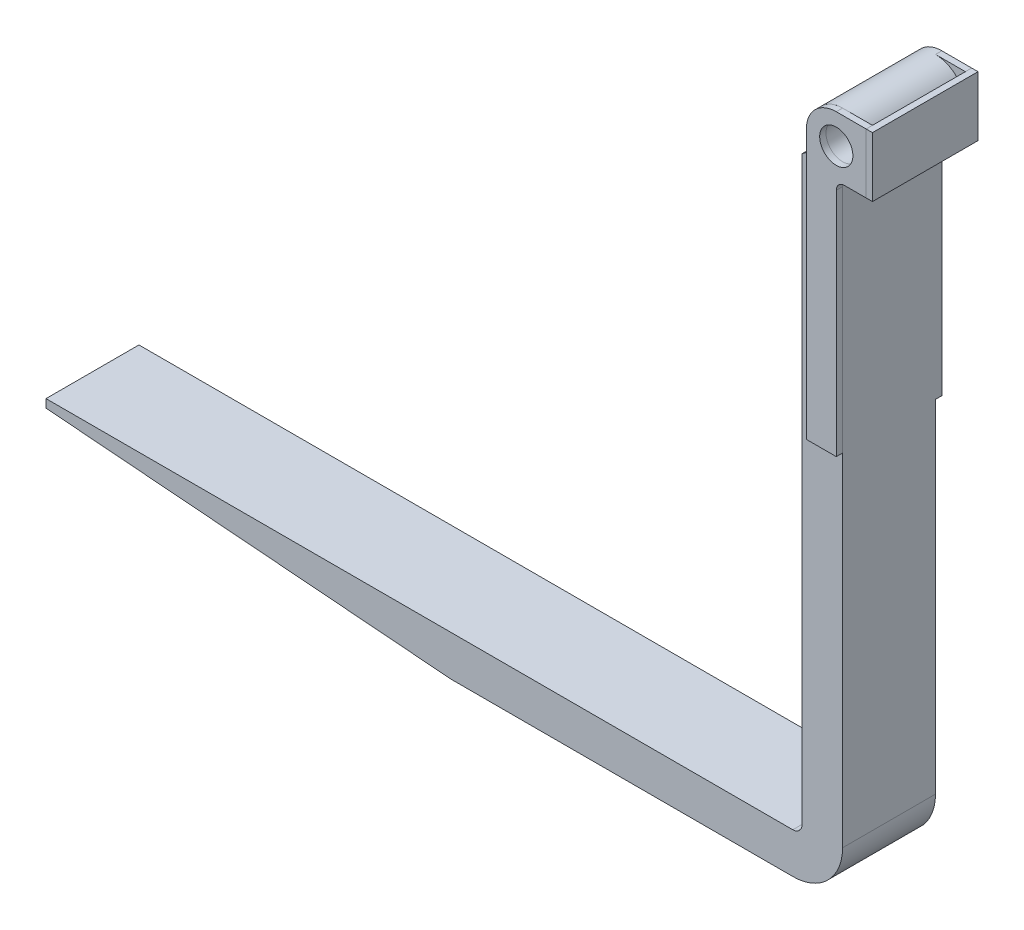
ISO-10303-21;
HEADER;
FILE_DESCRIPTION(('STEP AP214'),'2;1');
FILE_NAME('part.step','',(''),(''),'','','');
FILE_SCHEMA(('AUTOMOTIVE_DESIGN { 1 0 10303 214 1 1 1 1 }'));
ENDSEC;
DATA;
#1=APPLICATION_CONTEXT('core data for automotive mechanical design processes');
#2=APPLICATION_PROTOCOL_DEFINITION('international standard','automotive_design',2000,#1);
#3=PRODUCT_CONTEXT('',#1,'mechanical');
#4=PRODUCT('Part','Part','',(#3));
#5=PRODUCT_RELATED_PRODUCT_CATEGORY('part','',(#4));
#6=PRODUCT_DEFINITION_FORMATION('','',#4);
#7=PRODUCT_DEFINITION_CONTEXT('part definition',#1,'design');
#8=PRODUCT_DEFINITION('design','',#6,#7);
#9=PRODUCT_DEFINITION_SHAPE('','',#8);
#10=(LENGTH_UNIT() NAMED_UNIT(*) SI_UNIT(.MILLI.,.METRE.));
#11=(NAMED_UNIT(*) PLANE_ANGLE_UNIT() SI_UNIT($,.RADIAN.));
#12=(NAMED_UNIT(*) SI_UNIT($,.STERADIAN.) SOLID_ANGLE_UNIT());
#13=UNCERTAINTY_MEASURE_WITH_UNIT(LENGTH_MEASURE(1.E-05),#10,'distance_accuracy_value','');
#14=(GEOMETRIC_REPRESENTATION_CONTEXT(3) GLOBAL_UNCERTAINTY_ASSIGNED_CONTEXT((#13)) GLOBAL_UNIT_ASSIGNED_CONTEXT((#10,
#11,#12)) REPRESENTATION_CONTEXT('',''));
#15=CARTESIAN_POINT('',(0.,0.,0.));
#16=DIRECTION('',(0.,0.,1.));
#17=DIRECTION('',(1.,0.,0.));
#18=AXIS2_PLACEMENT_3D('',#15,#16,#17);
#19=CARTESIAN_POINT('',(54.5,1040.,79.5));
#20=DIRECTION('',(0.,0.,-1.));
#21=DIRECTION('',(-1.,0.,0.));
#22=AXIS2_PLACEMENT_3D('',#19,#20,#21);
#23=PLANE('',#22);
#24=DIRECTION('',(0.,-1.,0.));
#25=VECTOR('',#24,1.);
#26=CARTESIAN_POINT('',(45.,1040.,79.5));
#27=LINE('',#26,#25);
#28=CARTESIAN_POINT('',(45.,1040.,79.5));
#29=VERTEX_POINT('',#28);
#30=CARTESIAN_POINT('',(45.,950.,79.5));
#31=VERTEX_POINT('',#30);
#32=EDGE_CURVE('E110',#29,#31,#27,.T.);
#33=ORIENTED_EDGE('',*,*,#32,.T.);
#34=DIRECTION('',(-1.,0.,0.));
#35=VECTOR('',#34,1.);
#36=CARTESIAN_POINT('',(54.5,950.,79.5));
#37=LINE('',#36,#35);
#38=CARTESIAN_POINT('',(54.5,950.,79.5));
#39=VERTEX_POINT('',#38);
#40=EDGE_CURVE('E12',#39,#31,#37,.T.);
#41=ORIENTED_EDGE('',*,*,#40,.F.);
#42=DIRECTION('',(0.,-1.,0.));
#43=VECTOR('',#42,1.);
#44=CARTESIAN_POINT('',(54.5,1040.,79.5));
#45=LINE('',#44,#43);
#46=CARTESIAN_POINT('',(54.5,1040.,79.5));
#47=VERTEX_POINT('',#46);
#48=EDGE_CURVE('E98',#47,#39,#45,.T.);
#49=ORIENTED_EDGE('',*,*,#48,.F.);
#50=DIRECTION('',(-1.,0.,0.));
#51=VECTOR('',#50,1.);
#52=CARTESIAN_POINT('',(54.5,1040.,79.5));
#53=LINE('',#52,#51);
#54=EDGE_CURVE('E106',#47,#29,#53,.T.);
#55=ORIENTED_EDGE('',*,*,#54,.T.);
#56=EDGE_LOOP('',(#33,#41,#49,#55));
#57=FACE_BOUND('',#56,.T.);
#58=ADVANCED_FACE('F47',(#57),#23,.F.);
#59=CARTESIAN_POINT('',(54.5,950.,79.5));
#60=DIRECTION('',(0.,1.,0.));
#61=DIRECTION('',(0.,0.,1.));
#62=AXIS2_PLACEMENT_3D('',#59,#60,#61);
#63=PLANE('',#62);
#64=DIRECTION('',(0.,0.,-1.));
#65=VECTOR('',#64,1.);
#66=CARTESIAN_POINT('',(45.,950.,79.5));
#67=LINE('',#66,#65);
#68=CARTESIAN_POINT('',(45.,950.,-79.5));
#69=VERTEX_POINT('',#68);
#70=EDGE_CURVE('E102',#31,#69,#67,.T.);
#71=ORIENTED_EDGE('',*,*,#70,.T.);
#72=DIRECTION('',(-1.,0.,0.));
#73=VECTOR('',#72,1.);
#74=CARTESIAN_POINT('',(54.5,950.,-79.5));
#75=LINE('',#74,#73);
#76=CARTESIAN_POINT('',(54.5,950.,-79.5));
#77=VERTEX_POINT('',#76);
#78=EDGE_CURVE('E55',#77,#69,#75,.T.);
#79=ORIENTED_EDGE('',*,*,#78,.F.);
#80=DIRECTION('',(0.,0.,-1.));
#81=VECTOR('',#80,1.);
#82=CARTESIAN_POINT('',(54.5,950.,79.5));
#83=LINE('',#82,#81);
#84=EDGE_CURVE('E93',#39,#77,#83,.T.);
#85=ORIENTED_EDGE('',*,*,#84,.F.);
#86=ORIENTED_EDGE('',*,*,#40,.T.);
#87=EDGE_LOOP('',(#71,#79,#85,#86));
#88=FACE_BOUND('',#87,.T.);
#89=ADVANCED_FACE('F101',(#88),#63,.F.);
#90=CARTESIAN_POINT('',(54.5,1040.,-79.5));
#91=DIRECTION('',(0.,0.,1.));
#92=DIRECTION('',(1.,0.,0.));
#93=AXIS2_PLACEMENT_3D('',#90,#91,#92);
#94=PLANE('',#93);
#95=DIRECTION('',(0.,1.,0.));
#96=VECTOR('',#95,1.);
#97=CARTESIAN_POINT('',(45.,1040.,-79.5));
#98=LINE('',#97,#96);
#99=CARTESIAN_POINT('',(45.,1040.,-79.5));
#100=VERTEX_POINT('',#99);
#101=EDGE_CURVE('E80',#69,#100,#98,.T.);
#102=ORIENTED_EDGE('',*,*,#101,.T.);
#103=DIRECTION('',(-1.,0.,0.));
#104=VECTOR('',#103,1.);
#105=CARTESIAN_POINT('',(54.5,1040.,-79.5));
#106=LINE('',#105,#104);
#107=CARTESIAN_POINT('',(54.5,1040.,-79.5));
#108=VERTEX_POINT('',#107);
#109=EDGE_CURVE('E103',#108,#100,#106,.T.);
#110=ORIENTED_EDGE('',*,*,#109,.F.);
#111=DIRECTION('',(0.,1.,0.));
#112=VECTOR('',#111,1.);
#113=CARTESIAN_POINT('',(54.5,1040.,-79.5));
#114=LINE('',#113,#112);
#115=EDGE_CURVE('E96',#77,#108,#114,.T.);
#116=ORIENTED_EDGE('',*,*,#115,.F.);
#117=ORIENTED_EDGE('',*,*,#78,.T.);
#118=EDGE_LOOP('',(#102,#110,#116,#117));
#119=FACE_BOUND('',#118,.T.);
#120=ADVANCED_FACE('F104',(#119),#94,.F.);
#121=CARTESIAN_POINT('',(54.5,1040.,79.5));
#122=DIRECTION('',(0.,-1.,0.));
#123=DIRECTION('',(0.,0.,-1.));
#124=AXIS2_PLACEMENT_3D('',#121,#122,#123);
#125=PLANE('',#124);
#126=DIRECTION('',(0.,0.,1.));
#127=VECTOR('',#126,1.);
#128=CARTESIAN_POINT('',(45.,1040.,79.5));
#129=LINE('',#128,#127);
#130=EDGE_CURVE('E86',#100,#29,#129,.T.);
#131=ORIENTED_EDGE('',*,*,#130,.T.);
#132=ORIENTED_EDGE('',*,*,#54,.F.);
#133=DIRECTION('',(0.,0.,1.));
#134=VECTOR('',#133,1.);
#135=CARTESIAN_POINT('',(54.5,1040.,79.5));
#136=LINE('',#135,#134);
#137=EDGE_CURVE('E63',#108,#47,#136,.T.);
#138=ORIENTED_EDGE('',*,*,#137,.F.);
#139=ORIENTED_EDGE('',*,*,#109,.T.);
#140=EDGE_LOOP('',(#131,#132,#138,#139));
#141=FACE_BOUND('',#140,.T.);
#142=ADVANCED_FACE('F117',(#141),#125,.F.);
#143=CARTESIAN_POINT('',(54.5,950.,79.5));
#144=DIRECTION('',(1.,0.,0.));
#145=DIRECTION('',(0.,0.,-1.));
#146=AXIS2_PLACEMENT_3D('',#143,#144,#145);
#147=PLANE('',#146);
#148=ORIENTED_EDGE('',*,*,#48,.T.);
#149=ORIENTED_EDGE('',*,*,#84,.T.);
#150=ORIENTED_EDGE('',*,*,#115,.T.);
#151=ORIENTED_EDGE('',*,*,#137,.T.);
#152=EDGE_LOOP('',(#148,#149,#150,#151));
#153=FACE_BOUND('',#152,.T.);
#154=ADVANCED_FACE('F94',(#153),#147,.T.);
#155=CARTESIAN_POINT('',(45.,950.,79.5));
#156=DIRECTION('',(1.,0.,0.));
#157=DIRECTION('',(0.,0.,-1.));
#158=AXIS2_PLACEMENT_3D('',#155,#156,#157);
#159=PLANE('',#158);
#160=ORIENTED_EDGE('',*,*,#32,.F.);
#161=ORIENTED_EDGE('',*,*,#130,.F.);
#162=ORIENTED_EDGE('',*,*,#101,.F.);
#163=ORIENTED_EDGE('',*,*,#70,.F.);
#164=EDGE_LOOP('',(#160,#161,#162,#163));
#165=FACE_BOUND('',#164,.T.);
#166=ADVANCED_FACE('F120',(#165),#159,.F.);
#167=CLOSED_SHELL('',(#58,#89,#120,#142,#154,#166));
#168=MANIFOLD_SOLID_BREP('B2',#167);
#169=CARTESIAN_POINT('',(-1.11012405566185E-13,457.909002372828,79.5));
#170=DIRECTION('',(-1.,0.,0.));
#171=DIRECTION('',(0.,-1.,0.));
#172=AXIS2_PLACEMENT_3D('',#169,#170,#171);
#173=PLANE('',#172);
#174=DIRECTION('',(0.,1.,0.));
#175=VECTOR('',#174,1.);
#176=CARTESIAN_POINT('',(-1.11012405566185E-13,457.909002372828,70.));
#177=LINE('',#176,#175);
#178=CARTESIAN_POINT('',(-1.10472724874183E-13,590.,70.));
#179=VERTEX_POINT('',#178);
#180=CARTESIAN_POINT('',(-1.09052960023826E-13,937.5,70.));
#181=VERTEX_POINT('',#180);
#182=EDGE_CURVE('E279',#179,#181,#177,.T.);
#183=ORIENTED_EDGE('',*,*,#182,.T.);
#184=DIRECTION('',(0.,0.,-1.));
#185=VECTOR('',#184,1.);
#186=CARTESIAN_POINT('',(-1.09052960023826E-13,937.5,79.5));
#187=LINE('',#186,#185);
#188=CARTESIAN_POINT('',(-1.09052960023826E-13,937.5,79.5));
#189=VERTEX_POINT('',#188);
#190=EDGE_CURVE('E45',#189,#181,#187,.T.);
#191=ORIENTED_EDGE('',*,*,#190,.F.);
#192=DIRECTION('',(0.,1.,0.));
#193=VECTOR('',#192,1.);
#194=CARTESIAN_POINT('',(-1.11012405566185E-13,457.909002372828,79.5));
#195=LINE('',#194,#193);
#196=CARTESIAN_POINT('',(-1.10472724874183E-13,590.,79.5));
#197=VERTEX_POINT('',#196);
#198=EDGE_CURVE('E296',#197,#189,#195,.T.);
#199=ORIENTED_EDGE('',*,*,#198,.F.);
#200=DIRECTION('',(0.,0.,-1.));
#201=VECTOR('',#200,1.);
#202=CARTESIAN_POINT('',(-1.10472724874183E-13,590.,79.5));
#203=LINE('',#202,#201);
#204=EDGE_CURVE('E278',#197,#179,#203,.T.);
#205=ORIENTED_EDGE('',*,*,#204,.T.);
#206=EDGE_LOOP('',(#183,#191,#199,#205));
#207=FACE_BOUND('',#206,.T.);
#208=ADVANCED_FACE('F179',(#207),#173,.F.);
#209=CARTESIAN_POINT('',(12.4999999999999,937.5,79.5));
#210=DIRECTION('',(0.,0.,-1.));
#211=DIRECTION('',(-1.,0.,0.));
#212=AXIS2_PLACEMENT_3D('',#209,#210,#211);
#213=CYLINDRICAL_SURFACE('',#212,12.5);
#214=CARTESIAN_POINT('',(12.4999999999999,937.5,70.));
#215=DIRECTION('',(0.,0.,1.));
#216=DIRECTION('',(1.,0.,0.));
#217=AXIS2_PLACEMENT_3D('',#214,#215,#216);
#218=CIRCLE('',#217,12.5);
#219=CARTESIAN_POINT('',(12.5,950.,70.));
#220=VERTEX_POINT('',#219);
#221=EDGE_CURVE('E282',#181,#220,#218,.F.);
#222=ORIENTED_EDGE('',*,*,#221,.T.);
#223=DIRECTION('',(0.,0.,-1.));
#224=VECTOR('',#223,1.);
#225=CARTESIAN_POINT('',(12.5,950.,79.5));
#226=LINE('',#225,#224);
#227=CARTESIAN_POINT('',(12.5,950.,79.5));
#228=VERTEX_POINT('',#227);
#229=EDGE_CURVE('E187',#228,#220,#226,.T.);
#230=ORIENTED_EDGE('',*,*,#229,.F.);
#231=CARTESIAN_POINT('',(12.4999999999999,937.5,79.5));
#232=DIRECTION('',(0.,0.,1.));
#233=DIRECTION('',(1.,0.,0.));
#234=AXIS2_PLACEMENT_3D('',#231,#232,#233);
#235=CIRCLE('',#234,12.5);
#236=EDGE_CURVE('E238',#189,#228,#235,.F.);
#237=ORIENTED_EDGE('',*,*,#236,.F.);
#238=ORIENTED_EDGE('',*,*,#190,.T.);
#239=EDGE_LOOP('',(#222,#230,#237,#238));
#240=FACE_BOUND('',#239,.T.);
#241=ADVANCED_FACE('F332',(#240),#213,.F.);
#242=CARTESIAN_POINT('',(0.,950.,79.5));
#243=DIRECTION('',(0.,1.,0.));
#244=DIRECTION('',(0.,0.,1.));
#245=AXIS2_PLACEMENT_3D('',#242,#243,#244);
#246=PLANE('',#245);
#247=DIRECTION('',(1.,0.,0.));
#248=VECTOR('',#247,1.);
#249=CARTESIAN_POINT('',(0.,950.,70.));
#250=LINE('',#249,#248);
#251=CARTESIAN_POINT('',(45.,950.,70.));
#252=VERTEX_POINT('',#251);
#253=EDGE_CURVE('E284',#220,#252,#250,.T.);
#254=ORIENTED_EDGE('',*,*,#253,.T.);
#255=DIRECTION('',(0.,0.,-1.));
#256=VECTOR('',#255,1.);
#257=CARTESIAN_POINT('',(45.,950.,79.5));
#258=LINE('',#257,#256);
#259=CARTESIAN_POINT('',(45.,950.,79.5));
#260=VERTEX_POINT('',#259);
#261=EDGE_CURVE('E303',#260,#252,#258,.T.);
#262=ORIENTED_EDGE('',*,*,#261,.F.);
#263=DIRECTION('',(1.,0.,0.));
#264=VECTOR('',#263,1.);
#265=CARTESIAN_POINT('',(0.,950.,79.5));
#266=LINE('',#265,#264);
#267=EDGE_CURVE('E311',#228,#260,#266,.T.);
#268=ORIENTED_EDGE('',*,*,#267,.F.);
#269=ORIENTED_EDGE('',*,*,#229,.T.);
#270=EDGE_LOOP('',(#254,#262,#268,#269));
#271=FACE_BOUND('',#270,.T.);
#272=ADVANCED_FACE('F309',(#271),#246,.F.);
#273=CARTESIAN_POINT('',(45.,457.909002372828,79.5));
#274=DIRECTION('',(-1.,0.,0.));
#275=DIRECTION('',(0.,0.,1.));
#276=AXIS2_PLACEMENT_3D('',#273,#274,#275);
#277=PLANE('',#276);
#278=DIRECTION('',(0.,1.,0.));
#279=VECTOR('',#278,1.);
#280=CARTESIAN_POINT('',(45.,457.909002372828,70.));
#281=LINE('',#280,#279);
#282=CARTESIAN_POINT('',(45.,1040.,70.));
#283=VERTEX_POINT('',#282);
#284=EDGE_CURVE('E286',#252,#283,#281,.T.);
#285=ORIENTED_EDGE('',*,*,#284,.T.);
#286=DIRECTION('',(0.,0.,-1.));
#287=VECTOR('',#286,1.);
#288=CARTESIAN_POINT('',(45.,1040.,79.5));
#289=LINE('',#288,#287);
#290=CARTESIAN_POINT('',(45.,1040.,79.5));
#291=VERTEX_POINT('',#290);
#292=EDGE_CURVE('E300',#291,#283,#289,.T.);
#293=ORIENTED_EDGE('',*,*,#292,.F.);
#294=DIRECTION('',(0.,1.,0.));
#295=VECTOR('',#294,1.);
#296=CARTESIAN_POINT('',(45.,457.909002372828,79.5));
#297=LINE('',#296,#295);
#298=EDGE_CURVE('E324',#260,#291,#297,.T.);
#299=ORIENTED_EDGE('',*,*,#298,.F.);
#300=ORIENTED_EDGE('',*,*,#261,.T.);
#301=EDGE_LOOP('',(#285,#293,#299,#300));
#302=FACE_BOUND('',#301,.T.);
#303=ADVANCED_FACE('F320',(#302),#277,.F.);
#304=CARTESIAN_POINT('',(0.,1040.,79.5));
#305=DIRECTION('',(0.,-1.,0.));
#306=DIRECTION('',(0.,0.,-1.));
#307=AXIS2_PLACEMENT_3D('',#304,#305,#306);
#308=PLANE('',#307);
#309=DIRECTION('',(-1.,0.,0.));
#310=VECTOR('',#309,1.);
#311=CARTESIAN_POINT('',(0.,1040.,70.));
#312=LINE('',#311,#310);
#313=CARTESIAN_POINT('',(0.,1040.,70.));
#314=VERTEX_POINT('',#313);
#315=EDGE_CURVE('E288',#283,#314,#312,.T.);
#316=ORIENTED_EDGE('',*,*,#315,.T.);
#317=DIRECTION('',(0.,0.,-1.));
#318=VECTOR('',#317,1.);
#319=CARTESIAN_POINT('',(0.,1040.,79.5));
#320=LINE('',#319,#318);
#321=CARTESIAN_POINT('',(0.,1040.,79.5));
#322=VERTEX_POINT('',#321);
#323=EDGE_CURVE('E267',#322,#314,#320,.T.);
#324=ORIENTED_EDGE('',*,*,#323,.F.);
#325=DIRECTION('',(-1.,0.,0.));
#326=VECTOR('',#325,1.);
#327=CARTESIAN_POINT('',(0.,1040.,79.5));
#328=LINE('',#327,#326);
#329=EDGE_CURVE('E258',#291,#322,#328,.T.);
#330=ORIENTED_EDGE('',*,*,#329,.F.);
#331=ORIENTED_EDGE('',*,*,#292,.T.);
#332=EDGE_LOOP('',(#316,#324,#330,#331));
#333=FACE_BOUND('',#332,.T.);
#334=ADVANCED_FACE('F323',(#333),#308,.F.);
#335=CARTESIAN_POINT('',(0.,995.,79.5));
#336=DIRECTION('',(0.,0.,-1.));
#337=DIRECTION('',(-1.,0.,0.));
#338=AXIS2_PLACEMENT_3D('',#335,#336,#337);
#339=CYLINDRICAL_SURFACE('',#338,45.);
#340=CARTESIAN_POINT('',(0.,995.,70.));
#341=DIRECTION('',(0.,0.,1.));
#342=DIRECTION('',(1.,0.,0.));
#343=AXIS2_PLACEMENT_3D('',#340,#341,#342);
#344=CIRCLE('',#343,45.);
#345=CARTESIAN_POINT('',(-45.,995.,70.));
#346=VERTEX_POINT('',#345);
#347=EDGE_CURVE('E266',#314,#346,#344,.T.);
#348=ORIENTED_EDGE('',*,*,#347,.T.);
#349=DIRECTION('',(0.,0.,-1.));
#350=VECTOR('',#349,1.);
#351=CARTESIAN_POINT('',(-45.,995.,79.5));
#352=LINE('',#351,#350);
#353=CARTESIAN_POINT('',(-45.,995.,79.5));
#354=VERTEX_POINT('',#353);
#355=EDGE_CURVE('E263',#354,#346,#352,.T.);
#356=ORIENTED_EDGE('',*,*,#355,.F.);
#357=CARTESIAN_POINT('',(0.,995.,79.5));
#358=DIRECTION('',(0.,0.,1.));
#359=DIRECTION('',(1.,0.,0.));
#360=AXIS2_PLACEMENT_3D('',#357,#358,#359);
#361=CIRCLE('',#360,45.);
#362=EDGE_CURVE('E251',#322,#354,#361,.T.);
#363=ORIENTED_EDGE('',*,*,#362,.F.);
#364=ORIENTED_EDGE('',*,*,#323,.T.);
#365=EDGE_LOOP('',(#348,#356,#363,#364));
#366=FACE_BOUND('',#365,.T.);
#367=ADVANCED_FACE('F264',(#366),#339,.T.);
#368=CARTESIAN_POINT('',(-44.9999999999999,457.909002372828,79.5));
#369=DIRECTION('',(1.,0.,0.));
#370=DIRECTION('',(0.,1.,0.));
#371=AXIS2_PLACEMENT_3D('',#368,#369,#370);
#372=PLANE('',#371);
#373=DIRECTION('',(0.,-1.,0.));
#374=VECTOR('',#373,1.);
#375=CARTESIAN_POINT('',(-44.9999999999999,457.909002372828,70.));
#376=LINE('',#375,#374);
#377=CARTESIAN_POINT('',(-44.9999999999999,590.,70.));
#378=VERTEX_POINT('',#377);
#379=EDGE_CURVE('E224',#346,#378,#376,.T.);
#380=ORIENTED_EDGE('',*,*,#379,.T.);
#381=DIRECTION('',(0.,0.,-1.));
#382=VECTOR('',#381,1.);
#383=CARTESIAN_POINT('',(-44.9999999999999,590.,79.5));
#384=LINE('',#383,#382);
#385=CARTESIAN_POINT('',(-44.9999999999999,590.,79.5));
#386=VERTEX_POINT('',#385);
#387=EDGE_CURVE('E268',#386,#378,#384,.T.);
#388=ORIENTED_EDGE('',*,*,#387,.F.);
#389=DIRECTION('',(0.,-1.,0.));
#390=VECTOR('',#389,1.);
#391=CARTESIAN_POINT('',(-44.9999999999999,457.909002372828,79.5));
#392=LINE('',#391,#390);
#393=EDGE_CURVE('E256',#354,#386,#392,.T.);
#394=ORIENTED_EDGE('',*,*,#393,.F.);
#395=ORIENTED_EDGE('',*,*,#355,.T.);
#396=EDGE_LOOP('',(#380,#388,#394,#395));
#397=FACE_BOUND('',#396,.T.);
#398=ADVANCED_FACE('F270',(#397),#372,.F.);
#399=CARTESIAN_POINT('',(0.,590.,79.5));
#400=DIRECTION('',(0.,1.,0.));
#401=DIRECTION('',(0.,0.,1.));
#402=AXIS2_PLACEMENT_3D('',#399,#400,#401);
#403=PLANE('',#402);
#404=DIRECTION('',(1.,0.,0.));
#405=VECTOR('',#404,1.);
#406=CARTESIAN_POINT('',(0.,590.,70.));
#407=LINE('',#406,#405);
#408=EDGE_CURVE('E230',#378,#179,#407,.T.);
#409=ORIENTED_EDGE('',*,*,#408,.T.);
#410=ORIENTED_EDGE('',*,*,#204,.F.);
#411=DIRECTION('',(1.,0.,0.));
#412=VECTOR('',#411,1.);
#413=CARTESIAN_POINT('',(0.,590.,79.5));
#414=LINE('',#413,#412);
#415=EDGE_CURVE('E195',#386,#197,#414,.T.);
#416=ORIENTED_EDGE('',*,*,#415,.F.);
#417=ORIENTED_EDGE('',*,*,#387,.T.);
#418=EDGE_LOOP('',(#409,#410,#416,#417));
#419=FACE_BOUND('',#418,.T.);
#420=ADVANCED_FACE('F348',(#419),#403,.F.);
#421=CARTESIAN_POINT('',(0.,995.,79.5));
#422=DIRECTION('',(0.,0.,-1.));
#423=DIRECTION('',(-1.,0.,0.));
#424=AXIS2_PLACEMENT_3D('',#421,#422,#423);
#425=CYLINDRICAL_SURFACE('',#424,25.);
#426=CARTESIAN_POINT('',(0.,995.,79.5));
#427=DIRECTION('',(0.,0.,1.));
#428=DIRECTION('',(1.,0.,0.));
#429=AXIS2_PLACEMENT_3D('',#426,#427,#428);
#430=CIRCLE('',#429,25.);
#431=CARTESIAN_POINT('',(25.,995.,79.5));
#432=VERTEX_POINT('',#431);
#433=EDGE_CURVE('E272',#432,#432,#430,.F.);
#434=ORIENTED_EDGE('',*,*,#433,.F.);
#435=EDGE_LOOP('',(#434));
#436=FACE_BOUND('',#435,.T.);
#437=CARTESIAN_POINT('',(0.,995.,70.));
#438=DIRECTION('',(0.,0.,1.));
#439=DIRECTION('',(1.,0.,0.));
#440=AXIS2_PLACEMENT_3D('',#437,#438,#439);
#441=CIRCLE('',#440,25.);
#442=CARTESIAN_POINT('',(25.,995.,70.));
#443=VERTEX_POINT('',#442);
#444=EDGE_CURVE('E293',#443,#443,#441,.F.);
#445=ORIENTED_EDGE('',*,*,#444,.T.);
#446=EDGE_LOOP('',(#445));
#447=FACE_BOUND('',#446,.T.);
#448=ADVANCED_FACE('F351',(#436,#447),#425,.F.);
#449=CARTESIAN_POINT('',(0.,457.909002372828,79.5));
#450=DIRECTION('',(0.,0.,1.));
#451=DIRECTION('',(1.,0.,0.));
#452=AXIS2_PLACEMENT_3D('',#449,#450,#451);
#453=PLANE('',#452);
#454=ORIENTED_EDGE('',*,*,#198,.T.);
#455=ORIENTED_EDGE('',*,*,#236,.T.);
#456=ORIENTED_EDGE('',*,*,#267,.T.);
#457=ORIENTED_EDGE('',*,*,#298,.T.);
#458=ORIENTED_EDGE('',*,*,#329,.T.);
#459=ORIENTED_EDGE('',*,*,#362,.T.);
#460=ORIENTED_EDGE('',*,*,#393,.T.);
#461=ORIENTED_EDGE('',*,*,#415,.T.);
#462=EDGE_LOOP('',(#454,#455,#456,#457,#458,#459,#460,#461));
#463=FACE_BOUND('',#462,.T.);
#464=ORIENTED_EDGE('',*,*,#433,.T.);
#465=EDGE_LOOP('',(#464));
#466=FACE_BOUND('',#465,.T.);
#467=ADVANCED_FACE('F253',(#463,#466),#453,.T.);
#468=CARTESIAN_POINT('',(0.,457.909002372828,70.));
#469=DIRECTION('',(0.,0.,1.));
#470=DIRECTION('',(1.,0.,0.));
#471=AXIS2_PLACEMENT_3D('',#468,#469,#470);
#472=PLANE('',#471);
#473=ORIENTED_EDGE('',*,*,#182,.F.);
#474=ORIENTED_EDGE('',*,*,#408,.F.);
#475=ORIENTED_EDGE('',*,*,#379,.F.);
#476=ORIENTED_EDGE('',*,*,#347,.F.);
#477=ORIENTED_EDGE('',*,*,#315,.F.);
#478=ORIENTED_EDGE('',*,*,#284,.F.);
#479=ORIENTED_EDGE('',*,*,#253,.F.);
#480=ORIENTED_EDGE('',*,*,#221,.F.);
#481=EDGE_LOOP('',(#473,#474,#475,#476,#477,#478,#479,#480));
#482=FACE_BOUND('',#481,.T.);
#483=ORIENTED_EDGE('',*,*,#444,.F.);
#484=EDGE_LOOP('',(#483));
#485=FACE_BOUND('',#484,.T.);
#486=ADVANCED_FACE('F315',(#482,#485),#472,.F.);
#487=CLOSED_SHELL('',(#208,#241,#272,#303,#334,#367,#398,#420,#448,#467,#486));
#488=MANIFOLD_SOLID_BREP('B6',#487);
#489=CARTESIAN_POINT('',(0.,457.909002372828,-70.));
#490=DIRECTION('',(0.,0.,-1.));
#491=DIRECTION('',(1.,0.,0.));
#492=AXIS2_PLACEMENT_3D('',#489,#490,#491);
#493=PLANE('',#492);
#494=CARTESIAN_POINT('',(0.,995.,-70.));
#495=DIRECTION('',(0.,0.,1.));
#496=DIRECTION('',(1.,0.,0.));
#497=AXIS2_PLACEMENT_3D('',#494,#495,#496);
#498=CIRCLE('',#497,45.);
#499=CARTESIAN_POINT('',(-45.,995.,-70.));
#500=VERTEX_POINT('',#499);
#501=CARTESIAN_POINT('',(-36.2125858627836,968.28579731434,-70.));
#502=VERTEX_POINT('',#501);
#503=EDGE_CURVE('E592',#500,#502,#498,.T.);
#504=ORIENTED_EDGE('',*,*,#503,.F.);
#505=DIRECTION('',(0.,-1.,0.));
#506=VECTOR('',#505,1.);
#507=CARTESIAN_POINT('',(-44.9999999999999,457.909002372828,-70.));
#508=LINE('',#507,#506);
#509=CARTESIAN_POINT('',(-45.,961.803278688525,-70.));
#510=VERTEX_POINT('',#509);
#511=EDGE_CURVE('E600',#500,#510,#508,.T.);
#512=ORIENTED_EDGE('',*,*,#511,.T.);
#513=DIRECTION('',(0.804724130284081,0.593648948570221,0.));
#514=VECTOR('',#513,1.);
#515=CARTESIAN_POINT('',(-65.6827925451039,946.54548090935,-70.));
#516=LINE('',#515,#514);
#517=EDGE_CURVE('E606',#510,#502,#516,.T.);
#518=ORIENTED_EDGE('',*,*,#517,.T.);
#519=EDGE_LOOP('',(#504,#512,#518));
#520=FACE_BOUND('',#519,.T.);
#521=ADVANCED_FACE('F442',(#520),#493,.F.);
#522=CARTESIAN_POINT('',(-1.10154940724527E-13,950.,-70.));
#523=VERTEX_POINT('',#522);
#524=CARTESIAN_POINT('',(45.,995.,-70.));
#525=VERTEX_POINT('',#524);
#526=EDGE_CURVE('E490',#523,#525,#498,.T.);
#527=ORIENTED_EDGE('',*,*,#526,.F.);
#528=DIRECTION('',(0.,-1.,0.));
#529=VECTOR('',#528,1.);
#530=CARTESIAN_POINT('',(-1.10472726719486E-13,950.,-70.));
#531=LINE('',#530,#529);
#532=CARTESIAN_POINT('',(-1.09052960023826E-13,937.5,-70.));
#533=VERTEX_POINT('',#532);
#534=EDGE_CURVE('E898',#523,#533,#531,.T.);
#535=ORIENTED_EDGE('',*,*,#534,.T.);
#536=CARTESIAN_POINT('',(12.4999999999999,937.5,-70.));
#537=DIRECTION('',(0.,0.,1.));
#538=DIRECTION('',(1.,0.,0.));
#539=AXIS2_PLACEMENT_3D('',#536,#537,#538);
#540=CIRCLE('',#539,12.5);
#541=CARTESIAN_POINT('',(12.5,950.,-70.));
#542=VERTEX_POINT('',#541);
#543=EDGE_CURVE('E940',#533,#542,#540,.F.);
#544=ORIENTED_EDGE('',*,*,#543,.T.);
#545=DIRECTION('',(1.,0.,0.));
#546=VECTOR('',#545,1.);
#547=CARTESIAN_POINT('',(0.,950.,-70.));
#548=LINE('',#547,#546);
#549=CARTESIAN_POINT('',(45.,950.,-70.));
#550=VERTEX_POINT('',#549);
#551=EDGE_CURVE('E984',#542,#550,#548,.T.);
#552=ORIENTED_EDGE('',*,*,#551,.T.);
#553=DIRECTION('',(0.,1.,0.));
#554=VECTOR('',#553,1.);
#555=CARTESIAN_POINT('',(45.,457.909002372828,-70.));
#556=LINE('',#555,#554);
#557=EDGE_CURVE('E994',#550,#525,#556,.T.);
#558=ORIENTED_EDGE('',*,*,#557,.T.);
#559=EDGE_LOOP('',(#527,#535,#544,#552,#558));
#560=FACE_BOUND('',#559,.T.);
#561=ADVANCED_FACE('F641',(#560),#493,.F.);
#562=CARTESIAN_POINT('',(0.,1040.,-70.));
#563=VERTEX_POINT('',#562);
#564=EDGE_CURVE('E459',#525,#563,#498,.T.);
#565=ORIENTED_EDGE('',*,*,#564,.F.);
#566=CARTESIAN_POINT('',(45.,1040.,-70.));
#567=VERTEX_POINT('',#566);
#568=EDGE_CURVE('E993',#525,#567,#556,.T.);
#569=ORIENTED_EDGE('',*,*,#568,.T.);
#570=DIRECTION('',(-1.,0.,0.));
#571=VECTOR('',#570,1.);
#572=CARTESIAN_POINT('',(0.,1040.,-70.));
#573=LINE('',#572,#571);
#574=EDGE_CURVE('E1001',#567,#563,#573,.T.);
#575=ORIENTED_EDGE('',*,*,#574,.T.);
#576=EDGE_LOOP('',(#565,#569,#575));
#577=FACE_BOUND('',#576,.T.);
#578=ADVANCED_FACE('F638',(#577),#493,.F.);
#579=CARTESIAN_POINT('',(-65.6827925451039,946.54548090935,70.));
#580=DIRECTION('',(-0.593648948570221,0.804724130284081,0.));
#581=DIRECTION('',(-0.804724130284081,-0.593648948570221,0.));
#582=AXIS2_PLACEMENT_3D('',#579,#580,#581);
#583=PLANE('',#582);
#584=CARTESIAN_POINT('',(-61.0000000000001,950.,-70.));
#585=VERTEX_POINT('',#584);
#586=EDGE_CURVE('E480',#585,#510,#516,.T.);
#587=ORIENTED_EDGE('',*,*,#586,.F.);
#588=DIRECTION('',(0.,0.,-1.));
#589=VECTOR('',#588,1.);
#590=CARTESIAN_POINT('',(-61.0000000000001,950.,70.));
#591=LINE('',#590,#589);
#592=CARTESIAN_POINT('',(-61.0000000000001,950.,70.));
#593=VERTEX_POINT('',#592);
#594=EDGE_CURVE('E912',#593,#585,#591,.T.);
#595=ORIENTED_EDGE('',*,*,#594,.F.);
#596=DIRECTION('',(0.804724130284081,0.593648948570221,0.));
#597=VECTOR('',#596,1.);
#598=CARTESIAN_POINT('',(-65.6827925451039,946.54548090935,70.));
#599=LINE('',#598,#597);
#600=CARTESIAN_POINT('',(-36.2125858627836,968.28579731434,70.));
#601=VERTEX_POINT('',#600);
#602=EDGE_CURVE('E929',#593,#601,#599,.T.);
#603=ORIENTED_EDGE('',*,*,#602,.T.);
#604=DIRECTION('',(0.,0.,-1.));
#605=VECTOR('',#604,1.);
#606=CARTESIAN_POINT('',(-36.2125858627836,968.28579731434,70.));
#607=LINE('',#606,#605);
#608=EDGE_CURVE('E451',#601,#502,#607,.T.);
#609=ORIENTED_EDGE('',*,*,#608,.T.);
#610=ORIENTED_EDGE('',*,*,#517,.F.);
#611=EDGE_LOOP('',(#587,#595,#603,#609,#610));
#612=FACE_BOUND('',#611,.T.);
#613=ADVANCED_FACE('F444',(#612),#583,.T.);
#614=CARTESIAN_POINT('',(-7.25355179119502,867.341398998495,70.));
#615=DIRECTION('',(0.,0.,1.));
#616=DIRECTION('',(1.,0.,0.));
#617=AXIS2_PLACEMENT_3D('',#614,#615,#616);
#618=PLANE('',#617);
#619=DIRECTION('',(0.,-1.,0.));
#620=VECTOR('',#619,1.);
#621=CARTESIAN_POINT('',(-1.10472726719486E-13,950.,70.));
#622=LINE('',#621,#620);
#623=CARTESIAN_POINT('',(-1.10154940724527E-13,950.,70.));
#624=VERTEX_POINT('',#623);
#625=CARTESIAN_POINT('',(0.,75.0000000000005,70.));
#626=VERTEX_POINT('',#625);
#627=EDGE_CURVE('E876',#624,#626,#622,.T.);
#628=ORIENTED_EDGE('',*,*,#627,.F.);
#629=CARTESIAN_POINT('',(0.,995.,70.));
#630=DIRECTION('',(0.,0.,1.));
#631=DIRECTION('',(1.,0.,0.));
#632=AXIS2_PLACEMENT_3D('',#629,#630,#631);
#633=CIRCLE('',#632,45.);
#634=EDGE_CURVE('E609',#624,#601,#633,.T.);
#635=ORIENTED_EDGE('',*,*,#634,.T.);
#636=ORIENTED_EDGE('',*,*,#602,.F.);
#637=DIRECTION('',(0.,-1.,0.));
#638=VECTOR('',#637,1.);
#639=CARTESIAN_POINT('',(-61.0000000000001,950.,70.));
#640=LINE('',#639,#638);
#641=CARTESIAN_POINT('',(-61.,75.0000000000001,70.));
#642=VERTEX_POINT('',#641);
#643=EDGE_CURVE('E878',#593,#642,#640,.T.);
#644=ORIENTED_EDGE('',*,*,#643,.T.);
#645=CARTESIAN_POINT('',(-75.,75.,70.));
#646=DIRECTION('',(0.,0.,1.));
#647=DIRECTION('',(1.,0.,0.));
#648=AXIS2_PLACEMENT_3D('',#645,#646,#647);
#649=CIRCLE('',#648,14.);
#650=CARTESIAN_POINT('',(-75.0000000000005,61.,70.));
#651=VERTEX_POINT('',#650);
#652=EDGE_CURVE('E880',#642,#651,#649,.F.);
#653=ORIENTED_EDGE('',*,*,#652,.T.);
#654=DIRECTION('',(-1.,0.,0.));
#655=VECTOR('',#654,1.);
#656=CARTESIAN_POINT('',(-75.0000000000005,61.,70.));
#657=LINE('',#656,#655);
#658=CARTESIAN_POINT('',(-1200.,60.9999999999998,70.));
#659=VERTEX_POINT('',#658);
#660=EDGE_CURVE('E865',#651,#659,#657,.T.);
#661=ORIENTED_EDGE('',*,*,#660,.T.);
#662=DIRECTION('',(0.,1.,0.));
#663=VECTOR('',#662,1.);
#664=CARTESIAN_POINT('',(-1200.,-1.46957615897682E-13,70.));
#665=LINE('',#664,#663);
#666=CARTESIAN_POINT('',(-1200.,48.4999999999999,70.));
#667=VERTEX_POINT('',#666);
#668=EDGE_CURVE('E868',#667,#659,#665,.T.);
#669=ORIENTED_EDGE('',*,*,#668,.F.);
#670=DIRECTION('',(0.996854130580606,-0.0792580743166545,0.));
#671=VECTOR('',#670,1.);
#672=CARTESIAN_POINT('',(-84.1608042146896,-40.2183622878484,70.));
#673=LINE('',#672,#671);
#674=CARTESIAN_POINT('',(-589.999999999999,0.,70.));
#675=VERTEX_POINT('',#674);
#676=EDGE_CURVE('E849',#667,#675,#673,.T.);
#677=ORIENTED_EDGE('',*,*,#676,.T.);
#678=DIRECTION('',(-1.,0.,0.));
#679=VECTOR('',#678,1.);
#680=CARTESIAN_POINT('',(-75.0000000000005,0.,70.));
#681=LINE('',#680,#679);
#682=CARTESIAN_POINT('',(-75.0000000000005,0.,70.));
#683=VERTEX_POINT('',#682);
#684=EDGE_CURVE('E871',#683,#675,#681,.T.);
#685=ORIENTED_EDGE('',*,*,#684,.F.);
#686=CARTESIAN_POINT('',(-75.,75.,70.));
#687=DIRECTION('',(0.,0.,-1.));
#688=DIRECTION('',(-1.,0.,0.));
#689=AXIS2_PLACEMENT_3D('',#686,#687,#688);
#690=CIRCLE('',#689,75.);
#691=EDGE_CURVE('E873',#626,#683,#690,.T.);
#692=ORIENTED_EDGE('',*,*,#691,.F.);
#693=EDGE_LOOP('',(#628,#635,#636,#644,#653,#661,#669,#677,#685,#692));
#694=FACE_BOUND('',#693,.T.);
#695=CARTESIAN_POINT('',(0.,995.,70.));
#696=DIRECTION('',(0.,0.,1.));
#697=DIRECTION('',(1.,0.,0.));
#698=AXIS2_PLACEMENT_3D('',#695,#696,#697);
#699=CIRCLE('',#698,25.);
#700=CARTESIAN_POINT('',(25.,995.,70.));
#701=VERTEX_POINT('',#700);
#702=EDGE_CURVE('E611',#701,#701,#699,.T.);
#703=ORIENTED_EDGE('',*,*,#702,.F.);
#704=EDGE_LOOP('',(#703));
#705=FACE_BOUND('',#704,.T.);
#706=ADVANCED_FACE('F627',(#694,#705),#618,.T.);
#707=CARTESIAN_POINT('',(-7.25355179119502,867.341398998495,-70.));
#708=DIRECTION('',(0.,0.,1.));
#709=DIRECTION('',(1.,0.,0.));
#710=AXIS2_PLACEMENT_3D('',#707,#708,#709);
#711=PLANE('',#710);
#712=ORIENTED_EDGE('',*,*,#586,.T.);
#713=CARTESIAN_POINT('',(-44.9999999999999,590.,-70.));
#714=VERTEX_POINT('',#713);
#715=EDGE_CURVE('E177',#510,#714,#508,.T.);
#716=ORIENTED_EDGE('',*,*,#715,.T.);
#717=DIRECTION('',(1.,0.,0.));
#718=VECTOR('',#717,1.);
#719=CARTESIAN_POINT('',(0.,590.,-70.));
#720=LINE('',#719,#718);
#721=CARTESIAN_POINT('',(0.,590.,-70.));
#722=VERTEX_POINT('',#721);
#723=EDGE_CURVE('E621',#714,#722,#720,.T.);
#724=ORIENTED_EDGE('',*,*,#723,.T.);
#725=CARTESIAN_POINT('',(0.,75.0000000000005,-70.));
#726=VERTEX_POINT('',#725);
#727=EDGE_CURVE('E889',#722,#726,#531,.T.);
#728=ORIENTED_EDGE('',*,*,#727,.T.);
#729=CARTESIAN_POINT('',(-75.,75.,-70.));
#730=DIRECTION('',(0.,0.,-1.));
#731=DIRECTION('',(-1.,0.,0.));
#732=AXIS2_PLACEMENT_3D('',#729,#730,#731);
#733=CIRCLE('',#732,75.);
#734=CARTESIAN_POINT('',(-75.0000000000005,0.,-70.));
#735=VERTEX_POINT('',#734);
#736=EDGE_CURVE('E886',#726,#735,#733,.T.);
#737=ORIENTED_EDGE('',*,*,#736,.T.);
#738=DIRECTION('',(-1.,0.,0.));
#739=VECTOR('',#738,1.);
#740=CARTESIAN_POINT('',(-75.0000000000005,0.,-70.));
#741=LINE('',#740,#739);
#742=CARTESIAN_POINT('',(-590.,0.,-69.9999999999998));
#743=VERTEX_POINT('',#742);
#744=EDGE_CURVE('E884',#735,#743,#741,.T.);
#745=ORIENTED_EDGE('',*,*,#744,.T.);
#746=DIRECTION('',(0.996854130580606,-0.0792580743166545,0.));
#747=VECTOR('',#746,1.);
#748=CARTESIAN_POINT('',(-84.1608042146896,-40.2183622878484,-70.));
#749=LINE('',#748,#747);
#750=CARTESIAN_POINT('',(-1200.,48.4999999999999,-70.));
#751=VERTEX_POINT('',#750);
#752=EDGE_CURVE('E900',#751,#743,#749,.T.);
#753=ORIENTED_EDGE('',*,*,#752,.F.);
#754=DIRECTION('',(0.,1.,0.));
#755=VECTOR('',#754,1.);
#756=CARTESIAN_POINT('',(-1200.,-1.46957615897682E-13,-70.));
#757=LINE('',#756,#755);
#758=CARTESIAN_POINT('',(-1200.,60.9999999999998,-70.));
#759=VERTEX_POINT('',#758);
#760=EDGE_CURVE('E860',#751,#759,#757,.T.);
#761=ORIENTED_EDGE('',*,*,#760,.T.);
#762=DIRECTION('',(-1.,0.,0.));
#763=VECTOR('',#762,1.);
#764=CARTESIAN_POINT('',(-75.0000000000005,61.,-70.));
#765=LINE('',#764,#763);
#766=CARTESIAN_POINT('',(-75.0000000000005,61.,-70.));
#767=VERTEX_POINT('',#766);
#768=EDGE_CURVE('E857',#767,#759,#765,.T.);
#769=ORIENTED_EDGE('',*,*,#768,.F.);
#770=CARTESIAN_POINT('',(-75.,75.,-70.));
#771=DIRECTION('',(0.,0.,1.));
#772=DIRECTION('',(1.,0.,0.));
#773=AXIS2_PLACEMENT_3D('',#770,#771,#772);
#774=CIRCLE('',#773,14.);
#775=CARTESIAN_POINT('',(-61.,75.0000000000001,-70.));
#776=VERTEX_POINT('',#775);
#777=EDGE_CURVE('E869',#776,#767,#774,.F.);
#778=ORIENTED_EDGE('',*,*,#777,.F.);
#779=DIRECTION('',(0.,-1.,0.));
#780=VECTOR('',#779,1.);
#781=CARTESIAN_POINT('',(-61.0000000000001,950.,-70.));
#782=LINE('',#781,#780);
#783=EDGE_CURVE('E892',#585,#776,#782,.T.);
#784=ORIENTED_EDGE('',*,*,#783,.F.);
#785=EDGE_LOOP('',(#712,#716,#724,#728,#737,#745,#753,#761,#769,#778,#784));
#786=FACE_BOUND('',#785,.T.);
#787=ADVANCED_FACE('F629',(#786),#711,.F.);
#788=CARTESIAN_POINT('',(-1.11012405566185E-13,457.909002372828,-79.5));
#789=DIRECTION('',(-1.,0.,0.));
#790=DIRECTION('',(0.,-1.,0.));
#791=AXIS2_PLACEMENT_3D('',#788,#789,#790);
#792=PLANE('',#791);
#793=DIRECTION('',(0.,0.,1.));
#794=VECTOR('',#793,1.);
#795=CARTESIAN_POINT('',(-1.09052960023826E-13,937.5,-79.5));
#796=LINE('',#795,#794);
#797=CARTESIAN_POINT('',(-1.09052960023826E-13,937.5,-79.5));
#798=VERTEX_POINT('',#797);
#799=EDGE_CURVE('E902',#798,#533,#796,.T.);
#800=ORIENTED_EDGE('',*,*,#799,.T.);
#801=ORIENTED_EDGE('',*,*,#534,.F.);
#802=DIRECTION('',(0.,0.,-1.));
#803=VECTOR('',#802,1.);
#804=CARTESIAN_POINT('',(-1.10472726719486E-13,950.,70.));
#805=LINE('',#804,#803);
#806=EDGE_CURVE('E468',#624,#523,#805,.T.);
#807=ORIENTED_EDGE('',*,*,#806,.F.);
#808=ORIENTED_EDGE('',*,*,#627,.T.);
#809=DIRECTION('',(0.,0.,-1.));
#810=VECTOR('',#809,1.);
#811=CARTESIAN_POINT('',(0.,75.0000000000005,70.));
#812=LINE('',#811,#810);
#813=EDGE_CURVE('E908',#626,#726,#812,.T.);
#814=ORIENTED_EDGE('',*,*,#813,.T.);
#815=ORIENTED_EDGE('',*,*,#727,.F.);
#816=DIRECTION('',(0.,0.,1.));
#817=VECTOR('',#816,1.);
#818=CARTESIAN_POINT('',(-1.10472724874183E-13,590.,-79.5));
#819=LINE('',#818,#817);
#820=CARTESIAN_POINT('',(-1.10472724874183E-13,590.,-79.5));
#821=VERTEX_POINT('',#820);
#822=EDGE_CURVE('E938',#821,#722,#819,.T.);
#823=ORIENTED_EDGE('',*,*,#822,.F.);
#824=DIRECTION('',(0.,1.,0.));
#825=VECTOR('',#824,1.);
#826=CARTESIAN_POINT('',(-1.11012405566185E-13,457.909002372828,-79.5));
#827=LINE('',#826,#825);
#828=EDGE_CURVE('E941',#821,#798,#827,.T.);
#829=ORIENTED_EDGE('',*,*,#828,.T.);
#830=EDGE_LOOP('',(#800,#801,#807,#808,#814,#815,#823,#829));
#831=FACE_BOUND('',#830,.T.);
#832=ADVANCED_FACE('F636',(#831),#792,.F.);
#833=CARTESIAN_POINT('',(12.4999999999999,937.5,-79.5));
#834=DIRECTION('',(0.,0.,1.));
#835=DIRECTION('',(-1.,0.,0.));
#836=AXIS2_PLACEMENT_3D('',#833,#834,#835);
#837=CYLINDRICAL_SURFACE('',#836,12.5);
#838=ORIENTED_EDGE('',*,*,#543,.F.);
#839=ORIENTED_EDGE('',*,*,#799,.F.);
#840=CARTESIAN_POINT('',(12.4999999999999,937.5,-79.5));
#841=DIRECTION('',(0.,0.,1.));
#842=DIRECTION('',(1.,0.,0.));
#843=AXIS2_PLACEMENT_3D('',#840,#841,#842);
#844=CIRCLE('',#843,12.5);
#845=CARTESIAN_POINT('',(12.5,950.,-79.5));
#846=VERTEX_POINT('',#845);
#847=EDGE_CURVE('E974',#798,#846,#844,.F.);
#848=ORIENTED_EDGE('',*,*,#847,.T.);
#849=DIRECTION('',(0.,0.,1.));
#850=VECTOR('',#849,1.);
#851=CARTESIAN_POINT('',(12.5,950.,-79.5));
#852=LINE('',#851,#850);
#853=EDGE_CURVE('E946',#846,#542,#852,.T.);
#854=ORIENTED_EDGE('',*,*,#853,.T.);
#855=EDGE_LOOP('',(#838,#839,#848,#854));
#856=FACE_BOUND('',#855,.T.);
#857=ADVANCED_FACE('F680',(#856),#837,.F.);
#858=CARTESIAN_POINT('',(0.,950.,-79.5));
#859=DIRECTION('',(0.,1.,0.));
#860=DIRECTION('',(0.,0.,-1.));
#861=AXIS2_PLACEMENT_3D('',#858,#859,#860);
#862=PLANE('',#861);
#863=ORIENTED_EDGE('',*,*,#551,.F.);
#864=ORIENTED_EDGE('',*,*,#853,.F.);
#865=DIRECTION('',(1.,0.,0.));
#866=VECTOR('',#865,1.);
#867=CARTESIAN_POINT('',(0.,950.,-79.5));
#868=LINE('',#867,#866);
#869=CARTESIAN_POINT('',(45.,950.,-79.5));
#870=VERTEX_POINT('',#869);
#871=EDGE_CURVE('E990',#846,#870,#868,.T.);
#872=ORIENTED_EDGE('',*,*,#871,.T.);
#873=DIRECTION('',(0.,0.,1.));
#874=VECTOR('',#873,1.);
#875=CARTESIAN_POINT('',(45.,950.,-79.5));
#876=LINE('',#875,#874);
#877=EDGE_CURVE('E987',#870,#550,#876,.T.);
#878=ORIENTED_EDGE('',*,*,#877,.T.);
#879=EDGE_LOOP('',(#863,#864,#872,#878));
#880=FACE_BOUND('',#879,.T.);
#881=ADVANCED_FACE('F689',(#880),#862,.F.);
#882=CARTESIAN_POINT('',(45.,457.909002372828,-79.5));
#883=DIRECTION('',(-1.,0.,0.));
#884=DIRECTION('',(0.,0.,-1.));
#885=AXIS2_PLACEMENT_3D('',#882,#883,#884);
#886=PLANE('',#885);
#887=ORIENTED_EDGE('',*,*,#557,.F.);
#888=ORIENTED_EDGE('',*,*,#877,.F.);
#889=DIRECTION('',(0.,1.,0.));
#890=VECTOR('',#889,1.);
#891=CARTESIAN_POINT('',(45.,457.909002372828,-79.5));
#892=LINE('',#891,#890);
#893=CARTESIAN_POINT('',(45.,1040.,-79.5));
#894=VERTEX_POINT('',#893);
#895=EDGE_CURVE('E999',#870,#894,#892,.T.);
#896=ORIENTED_EDGE('',*,*,#895,.T.);
#897=DIRECTION('',(0.,0.,1.));
#898=VECTOR('',#897,1.);
#899=CARTESIAN_POINT('',(45.,1040.,-79.5));
#900=LINE('',#899,#898);
#901=EDGE_CURVE('E996',#894,#567,#900,.T.);
#902=ORIENTED_EDGE('',*,*,#901,.T.);
#903=ORIENTED_EDGE('',*,*,#568,.F.);
#904=EDGE_LOOP('',(#887,#888,#896,#902,#903));
#905=FACE_BOUND('',#904,.T.);
#906=ADVANCED_FACE('F699',(#905),#886,.F.);
#907=CARTESIAN_POINT('',(0.,1040.,-79.5));
#908=DIRECTION('',(0.,-1.,0.));
#909=DIRECTION('',(0.,0.,1.));
#910=AXIS2_PLACEMENT_3D('',#907,#908,#909);
#911=PLANE('',#910);
#912=ORIENTED_EDGE('',*,*,#574,.F.);
#913=ORIENTED_EDGE('',*,*,#901,.F.);
#914=DIRECTION('',(-1.,0.,0.));
#915=VECTOR('',#914,1.);
#916=CARTESIAN_POINT('',(0.,1040.,-79.5));
#917=LINE('',#916,#915);
#918=CARTESIAN_POINT('',(0.,1040.,-79.5));
#919=VERTEX_POINT('',#918);
#920=EDGE_CURVE('E597',#894,#919,#917,.T.);
#921=ORIENTED_EDGE('',*,*,#920,.T.);
#922=DIRECTION('',(0.,0.,1.));
#923=VECTOR('',#922,1.);
#924=CARTESIAN_POINT('',(0.,1040.,-79.5));
#925=LINE('',#924,#923);
#926=EDGE_CURVE('E955',#919,#563,#925,.T.);
#927=ORIENTED_EDGE('',*,*,#926,.T.);
#928=EDGE_LOOP('',(#912,#913,#921,#927));
#929=FACE_BOUND('',#928,.T.);
#930=ADVANCED_FACE('F709',(#929),#911,.F.);
#931=CARTESIAN_POINT('',(0.,995.,-79.5));
#932=DIRECTION('',(0.,0.,1.));
#933=DIRECTION('',(-1.,0.,0.));
#934=AXIS2_PLACEMENT_3D('',#931,#932,#933);
#935=CYLINDRICAL_SURFACE('',#934,45.);
#936=DIRECTION('',(0.,0.,1.));
#937=VECTOR('',#936,1.);
#938=CARTESIAN_POINT('',(-45.,995.,-79.5));
#939=LINE('',#938,#937);
#940=CARTESIAN_POINT('',(-45.,995.,-79.5));
#941=VERTEX_POINT('',#940);
#942=EDGE_CURVE('E587',#941,#500,#939,.T.);
#943=ORIENTED_EDGE('',*,*,#942,.T.);
#944=ORIENTED_EDGE('',*,*,#503,.T.);
#945=ORIENTED_EDGE('',*,*,#608,.F.);
#946=ORIENTED_EDGE('',*,*,#634,.F.);
#947=ORIENTED_EDGE('',*,*,#806,.T.);
#948=ORIENTED_EDGE('',*,*,#526,.T.);
#949=ORIENTED_EDGE('',*,*,#564,.T.);
#950=ORIENTED_EDGE('',*,*,#926,.F.);
#951=CARTESIAN_POINT('',(0.,995.,-79.5));
#952=DIRECTION('',(0.,0.,1.));
#953=DIRECTION('',(1.,0.,0.));
#954=AXIS2_PLACEMENT_3D('',#951,#952,#953);
#955=CIRCLE('',#954,45.);
#956=EDGE_CURVE('E594',#919,#941,#955,.T.);
#957=ORIENTED_EDGE('',*,*,#956,.T.);
#958=EDGE_LOOP('',(#943,#944,#945,#946,#947,#948,#949,#950,#957));
#959=FACE_BOUND('',#958,.T.);
#960=ADVANCED_FACE('F589',(#959),#935,.T.);
#961=CARTESIAN_POINT('',(-44.9999999999999,457.909002372828,-79.5));
#962=DIRECTION('',(1.,0.,0.));
#963=DIRECTION('',(0.,1.,0.));
#964=AXIS2_PLACEMENT_3D('',#961,#962,#963);
#965=PLANE('',#964);
#966=ORIENTED_EDGE('',*,*,#511,.F.);
#967=ORIENTED_EDGE('',*,*,#942,.F.);
#968=DIRECTION('',(0.,-1.,0.));
#969=VECTOR('',#968,1.);
#970=CARTESIAN_POINT('',(-44.9999999999999,457.909002372828,-79.5));
#971=LINE('',#970,#969);
#972=CARTESIAN_POINT('',(-44.9999999999999,590.,-79.5));
#973=VERTEX_POINT('',#972);
#974=EDGE_CURVE('E962',#941,#973,#971,.T.);
#975=ORIENTED_EDGE('',*,*,#974,.T.);
#976=DIRECTION('',(0.,0.,1.));
#977=VECTOR('',#976,1.);
#978=CARTESIAN_POINT('',(-44.9999999999999,590.,-79.5));
#979=LINE('',#978,#977);
#980=EDGE_CURVE('E604',#973,#714,#979,.T.);
#981=ORIENTED_EDGE('',*,*,#980,.T.);
#982=ORIENTED_EDGE('',*,*,#715,.F.);
#983=EDGE_LOOP('',(#966,#967,#975,#981,#982));
#984=FACE_BOUND('',#983,.T.);
#985=ADVANCED_FACE('F601',(#984),#965,.F.);
#986=CARTESIAN_POINT('',(0.,590.,-79.5));
#987=DIRECTION('',(0.,1.,0.));
#988=DIRECTION('',(0.,0.,-1.));
#989=AXIS2_PLACEMENT_3D('',#986,#987,#988);
#990=PLANE('',#989);
#991=ORIENTED_EDGE('',*,*,#723,.F.);
#992=ORIENTED_EDGE('',*,*,#980,.F.);
#993=DIRECTION('',(1.,0.,0.));
#994=VECTOR('',#993,1.);
#995=CARTESIAN_POINT('',(0.,590.,-79.5));
#996=LINE('',#995,#994);
#997=EDGE_CURVE('E963',#973,#821,#996,.T.);
#998=ORIENTED_EDGE('',*,*,#997,.T.);
#999=ORIENTED_EDGE('',*,*,#822,.T.);
#1000=EDGE_LOOP('',(#991,#992,#998,#999));
#1001=FACE_BOUND('',#1000,.T.);
#1002=ADVANCED_FACE('F737',(#1001),#990,.F.);
#1003=CARTESIAN_POINT('',(0.,995.,-79.5));
#1004=DIRECTION('',(0.,0.,1.));
#1005=DIRECTION('',(-1.,0.,0.));
#1006=AXIS2_PLACEMENT_3D('',#1003,#1004,#1005);
#1007=CYLINDRICAL_SURFACE('',#1006,25.);
#1008=CARTESIAN_POINT('',(0.,995.,-79.5));
#1009=DIRECTION('',(0.,0.,1.));
#1010=DIRECTION('',(1.,0.,0.));
#1011=AXIS2_PLACEMENT_3D('',#1008,#1009,#1010);
#1012=CIRCLE('',#1011,25.);
#1013=CARTESIAN_POINT('',(25.,995.,-79.5));
#1014=VERTEX_POINT('',#1013);
#1015=EDGE_CURVE('E935',#1014,#1014,#1012,.F.);
#1016=ORIENTED_EDGE('',*,*,#1015,.T.);
#1017=EDGE_LOOP('',(#1016));
#1018=FACE_BOUND('',#1017,.T.);
#1019=ORIENTED_EDGE('',*,*,#702,.T.);
#1020=EDGE_LOOP('',(#1019));
#1021=FACE_BOUND('',#1020,.T.);
#1022=ADVANCED_FACE('F625',(#1018,#1021),#1007,.F.);
#1023=CARTESIAN_POINT('',(0.,457.909002372828,-79.5));
#1024=DIRECTION('',(0.,0.,-1.));
#1025=DIRECTION('',(1.,0.,0.));
#1026=AXIS2_PLACEMENT_3D('',#1023,#1024,#1025);
#1027=PLANE('',#1026);
#1028=ORIENTED_EDGE('',*,*,#828,.F.);
#1029=ORIENTED_EDGE('',*,*,#997,.F.);
#1030=ORIENTED_EDGE('',*,*,#974,.F.);
#1031=ORIENTED_EDGE('',*,*,#956,.F.);
#1032=ORIENTED_EDGE('',*,*,#920,.F.);
#1033=ORIENTED_EDGE('',*,*,#895,.F.);
#1034=ORIENTED_EDGE('',*,*,#871,.F.);
#1035=ORIENTED_EDGE('',*,*,#847,.F.);
#1036=EDGE_LOOP('',(#1028,#1029,#1030,#1031,#1032,#1033,#1034,#1035));
#1037=FACE_BOUND('',#1036,.T.);
#1038=ORIENTED_EDGE('',*,*,#1015,.F.);
#1039=EDGE_LOOP('',(#1038));
#1040=FACE_BOUND('',#1039,.T.);
#1041=ADVANCED_FACE('F755',(#1037,#1040),#1027,.T.);
#1042=CARTESIAN_POINT('',(-75.0000000000005,61.,70.));
#1043=DIRECTION('',(0.,-1.,0.));
#1044=DIRECTION('',(1.,0.,0.));
#1045=AXIS2_PLACEMENT_3D('',#1042,#1043,#1044);
#1046=PLANE('',#1045);
#1047=ORIENTED_EDGE('',*,*,#768,.T.);
#1048=DIRECTION('',(0.,0.,-1.));
#1049=VECTOR('',#1048,1.);
#1050=CARTESIAN_POINT('',(-1200.,60.9999999999998,70.));
#1051=LINE('',#1050,#1049);
#1052=EDGE_CURVE('E903',#659,#759,#1051,.T.);
#1053=ORIENTED_EDGE('',*,*,#1052,.F.);
#1054=ORIENTED_EDGE('',*,*,#660,.F.);
#1055=DIRECTION('',(0.,0.,-1.));
#1056=VECTOR('',#1055,1.);
#1057=CARTESIAN_POINT('',(-75.0000000000005,61.,70.));
#1058=LINE('',#1057,#1056);
#1059=EDGE_CURVE('E881',#651,#767,#1058,.T.);
#1060=ORIENTED_EDGE('',*,*,#1059,.T.);
#1061=EDGE_LOOP('',(#1047,#1053,#1054,#1060));
#1062=FACE_BOUND('',#1061,.T.);
#1063=ADVANCED_FACE('F767',(#1062),#1046,.F.);
#1064=CARTESIAN_POINT('',(-1200.,-1.46957615897682E-13,70.));
#1065=DIRECTION('',(-1.,0.,0.));
#1066=DIRECTION('',(0.,0.,1.));
#1067=AXIS2_PLACEMENT_3D('',#1064,#1065,#1066);
#1068=PLANE('',#1067);
#1069=DIRECTION('',(0.,0.,-1.));
#1070=VECTOR('',#1069,1.);
#1071=CARTESIAN_POINT('',(-1200.,48.4999999999999,2166.14061172003));
#1072=LINE('',#1071,#1070);
#1073=EDGE_CURVE('E851',#667,#751,#1072,.T.);
#1074=ORIENTED_EDGE('',*,*,#1073,.F.);
#1075=ORIENTED_EDGE('',*,*,#668,.T.);
#1076=ORIENTED_EDGE('',*,*,#1052,.T.);
#1077=ORIENTED_EDGE('',*,*,#760,.F.);
#1078=EDGE_LOOP('',(#1074,#1075,#1076,#1077));
#1079=FACE_BOUND('',#1078,.T.);
#1080=ADVANCED_FACE('F777',(#1079),#1068,.T.);
#1081=CARTESIAN_POINT('',(-75.0000000000005,0.,70.));
#1082=DIRECTION('',(0.,-1.,0.));
#1083=DIRECTION('',(1.,0.,0.));
#1084=AXIS2_PLACEMENT_3D('',#1081,#1082,#1083);
#1085=PLANE('',#1084);
#1086=DIRECTION('',(0.,0.,-1.));
#1087=VECTOR('',#1086,1.);
#1088=CARTESIAN_POINT('',(-590.,0.,2166.14061172003));
#1089=LINE('',#1088,#1087);
#1090=EDGE_CURVE('E853',#675,#743,#1089,.T.);
#1091=ORIENTED_EDGE('',*,*,#1090,.T.);
#1092=ORIENTED_EDGE('',*,*,#744,.F.);
#1093=DIRECTION('',(0.,0.,-1.));
#1094=VECTOR('',#1093,1.);
#1095=CARTESIAN_POINT('',(-75.0000000000005,0.,70.));
#1096=LINE('',#1095,#1094);
#1097=EDGE_CURVE('E906',#683,#735,#1096,.T.);
#1098=ORIENTED_EDGE('',*,*,#1097,.F.);
#1099=ORIENTED_EDGE('',*,*,#684,.T.);
#1100=EDGE_LOOP('',(#1091,#1092,#1098,#1099));
#1101=FACE_BOUND('',#1100,.T.);
#1102=ADVANCED_FACE('F787',(#1101),#1085,.T.);
#1103=CARTESIAN_POINT('',(-75.,75.,70.));
#1104=DIRECTION('',(0.,0.,-1.));
#1105=DIRECTION('',(-1.,0.,0.));
#1106=AXIS2_PLACEMENT_3D('',#1103,#1104,#1105);
#1107=CYLINDRICAL_SURFACE('',#1106,75.);
#1108=ORIENTED_EDGE('',*,*,#736,.F.);
#1109=ORIENTED_EDGE('',*,*,#813,.F.);
#1110=ORIENTED_EDGE('',*,*,#691,.T.);
#1111=ORIENTED_EDGE('',*,*,#1097,.T.);
#1112=EDGE_LOOP('',(#1108,#1109,#1110,#1111));
#1113=FACE_BOUND('',#1112,.T.);
#1114=ADVANCED_FACE('F797',(#1113),#1107,.T.);
#1115=CARTESIAN_POINT('',(-61.0000000000001,950.,70.));
#1116=DIRECTION('',(1.,0.,0.));
#1117=DIRECTION('',(0.,1.,0.));
#1118=AXIS2_PLACEMENT_3D('',#1115,#1116,#1117);
#1119=PLANE('',#1118);
#1120=ORIENTED_EDGE('',*,*,#783,.T.);
#1121=DIRECTION('',(0.,0.,-1.));
#1122=VECTOR('',#1121,1.);
#1123=CARTESIAN_POINT('',(-61.,75.0000000000001,70.));
#1124=LINE('',#1123,#1122);
#1125=EDGE_CURVE('E914',#642,#776,#1124,.T.);
#1126=ORIENTED_EDGE('',*,*,#1125,.F.);
#1127=ORIENTED_EDGE('',*,*,#643,.F.);
#1128=ORIENTED_EDGE('',*,*,#594,.T.);
#1129=EDGE_LOOP('',(#1120,#1126,#1127,#1128));
#1130=FACE_BOUND('',#1129,.T.);
#1131=ADVANCED_FACE('F807',(#1130),#1119,.F.);
#1132=CARTESIAN_POINT('',(-75.,75.,70.));
#1133=DIRECTION('',(0.,0.,-1.));
#1134=DIRECTION('',(-1.,0.,0.));
#1135=AXIS2_PLACEMENT_3D('',#1132,#1133,#1134);
#1136=CYLINDRICAL_SURFACE('',#1135,14.);
#1137=ORIENTED_EDGE('',*,*,#777,.T.);
#1138=ORIENTED_EDGE('',*,*,#1059,.F.);
#1139=ORIENTED_EDGE('',*,*,#652,.F.);
#1140=ORIENTED_EDGE('',*,*,#1125,.T.);
#1141=EDGE_LOOP('',(#1137,#1138,#1139,#1140));
#1142=FACE_BOUND('',#1141,.T.);
#1143=ADVANCED_FACE('F817',(#1142),#1136,.F.);
#1144=CARTESIAN_POINT('',(-1200.,48.4999999999999,2166.14061172003));
#1145=DIRECTION('',(0.0792580743166545,0.996854130580606,0.));
#1146=DIRECTION('',(-0.996854130580606,0.0792580743166545,0.));
#1147=AXIS2_PLACEMENT_3D('',#1144,#1145,#1146);
#1148=PLANE('',#1147);
#1149=ORIENTED_EDGE('',*,*,#676,.F.);
#1150=ORIENTED_EDGE('',*,*,#1073,.T.);
#1151=ORIENTED_EDGE('',*,*,#752,.T.);
#1152=ORIENTED_EDGE('',*,*,#1090,.F.);
#1153=EDGE_LOOP('',(#1149,#1150,#1151,#1152));
#1154=FACE_BOUND('',#1153,.T.);
#1155=ADVANCED_FACE('F827',(#1154),#1148,.F.);
#1156=CLOSED_SHELL('',(#521,#561,#578,#613,#706,#787,#832,#857,#881,#906,#930,#960,#985,#1002,
#1022,#1041,#1063,#1080,#1102,#1114,#1131,#1143,#1155));
#1157=MANIFOLD_SOLID_BREP('B39',#1156);
#1158=ADVANCED_BREP_SHAPE_REPRESENTATION('',(#18,#168,#488,#1157),#14);
#1159=SHAPE_DEFINITION_REPRESENTATION(#9,#1158);
ENDSEC;
END-ISO-10303-21;
